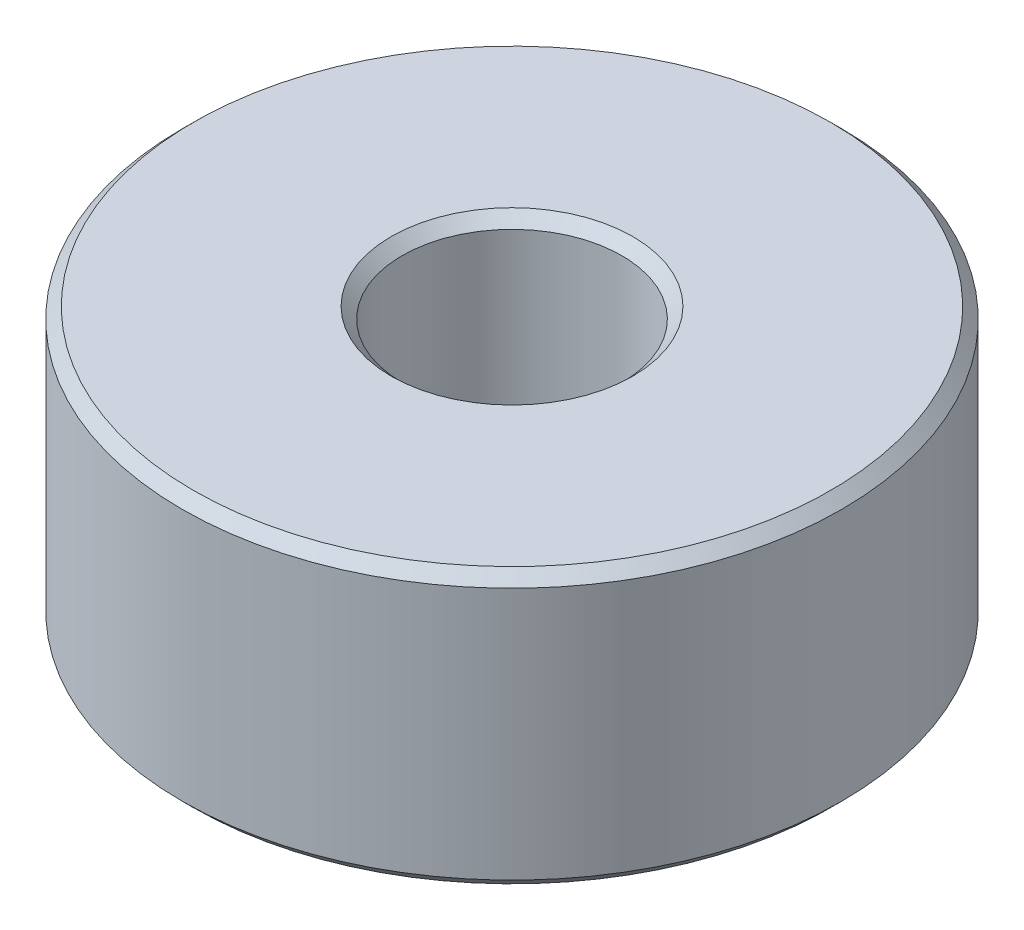
ISO-10303-21;
HEADER;
FILE_DESCRIPTION(('STEP AP214'),'2;1');
FILE_NAME('part.step','',(''),(''),'','','');
FILE_SCHEMA(('AUTOMOTIVE_DESIGN { 1 0 10303 214 1 1 1 1 }'));
ENDSEC;
DATA;
#1=APPLICATION_CONTEXT('core data for automotive mechanical design processes');
#2=APPLICATION_PROTOCOL_DEFINITION('international standard','automotive_design',2000,#1);
#3=PRODUCT_CONTEXT('',#1,'mechanical');
#4=PRODUCT('Part','Part','',(#3));
#5=PRODUCT_RELATED_PRODUCT_CATEGORY('part','',(#4));
#6=PRODUCT_DEFINITION_FORMATION('','',#4);
#7=PRODUCT_DEFINITION_CONTEXT('part definition',#1,'design');
#8=PRODUCT_DEFINITION('design','',#6,#7);
#9=PRODUCT_DEFINITION_SHAPE('','',#8);
#10=(LENGTH_UNIT() NAMED_UNIT(*) SI_UNIT(.MILLI.,.METRE.));
#11=(NAMED_UNIT(*) PLANE_ANGLE_UNIT() SI_UNIT($,.RADIAN.));
#12=(NAMED_UNIT(*) SI_UNIT($,.STERADIAN.) SOLID_ANGLE_UNIT());
#13=UNCERTAINTY_MEASURE_WITH_UNIT(LENGTH_MEASURE(1.E-05),#10,'distance_accuracy_value','');
#14=(GEOMETRIC_REPRESENTATION_CONTEXT(3) GLOBAL_UNCERTAINTY_ASSIGNED_CONTEXT((#13)) GLOBAL_UNIT_ASSIGNED_CONTEXT((#10,
#11,#12)) REPRESENTATION_CONTEXT('',''));
#15=CARTESIAN_POINT('',(0.,0.,0.));
#16=DIRECTION('',(0.,0.,1.));
#17=DIRECTION('',(1.,0.,0.));
#18=AXIS2_PLACEMENT_3D('',#15,#16,#17);
#19=CARTESIAN_POINT('',(0.,2.5,0.));
#20=DIRECTION('',(0.,1.,0.));
#21=DIRECTION('',(0.,0.,1.));
#22=AXIS2_PLACEMENT_3D('',#19,#20,#21);
#23=PLANE('',#22);
#24=CARTESIAN_POINT('',(0.,2.5,0.));
#25=DIRECTION('',(0.,1.,0.));
#26=DIRECTION('',(0.,0.,1.));
#27=AXIS2_PLACEMENT_3D('',#24,#25,#26);
#28=CIRCLE('',#27,1.1);
#29=CARTESIAN_POINT('',(0.,2.5,1.1));
#30=VERTEX_POINT('',#29);
#31=EDGE_CURVE('E10',#30,#30,#28,.F.);
#32=ORIENTED_EDGE('',*,*,#31,.T.);
#33=EDGE_LOOP('',(#32));
#34=FACE_BOUND('',#33,.T.);
#35=CARTESIAN_POINT('',(0.,2.5,0.));
#36=DIRECTION('',(0.,1.,0.));
#37=DIRECTION('',(0.,0.,1.));
#38=AXIS2_PLACEMENT_3D('',#35,#36,#37);
#39=CIRCLE('',#38,2.9);
#40=CARTESIAN_POINT('',(0.,2.5,2.9));
#41=VERTEX_POINT('',#40);
#42=EDGE_CURVE('E40',#41,#41,#39,.T.);
#43=ORIENTED_EDGE('',*,*,#42,.T.);
#44=EDGE_LOOP('',(#43));
#45=FACE_BOUND('',#44,.T.);
#46=ADVANCED_FACE('F32',(#34,#45),#23,.T.);
#47=CARTESIAN_POINT('',(0.,0.,0.));
#48=DIRECTION('',(0.,1.,0.));
#49=DIRECTION('',(0.,0.,1.));
#50=AXIS2_PLACEMENT_3D('',#47,#48,#49);
#51=PLANE('',#50);
#52=CARTESIAN_POINT('',(0.,0.,0.));
#53=DIRECTION('',(0.,1.,0.));
#54=DIRECTION('',(0.,0.,1.));
#55=AXIS2_PLACEMENT_3D('',#52,#53,#54);
#56=CIRCLE('',#55,1.1);
#57=CARTESIAN_POINT('',(0.,0.,1.1));
#58=VERTEX_POINT('',#57);
#59=EDGE_CURVE('E59',#58,#58,#56,.T.);
#60=ORIENTED_EDGE('',*,*,#59,.T.);
#61=EDGE_LOOP('',(#60));
#62=FACE_BOUND('',#61,.T.);
#63=CARTESIAN_POINT('',(0.,0.,0.));
#64=DIRECTION('',(0.,1.,0.));
#65=DIRECTION('',(0.,0.,1.));
#66=AXIS2_PLACEMENT_3D('',#63,#64,#65);
#67=CIRCLE('',#66,2.9);
#68=CARTESIAN_POINT('',(0.,0.,2.9));
#69=VERTEX_POINT('',#68);
#70=EDGE_CURVE('E62',#69,#69,#67,.F.);
#71=ORIENTED_EDGE('',*,*,#70,.T.);
#72=EDGE_LOOP('',(#71));
#73=FACE_BOUND('',#72,.T.);
#74=ADVANCED_FACE('F66',(#62,#73),#51,.F.);
#75=CARTESIAN_POINT('',(0.,2.5,0.));
#76=DIRECTION('',(0.,-1.,0.));
#77=DIRECTION('',(0.,0.,-1.));
#78=AXIS2_PLACEMENT_3D('',#75,#76,#77);
#79=CYLINDRICAL_SURFACE('',#78,3.);
#80=CARTESIAN_POINT('',(0.,0.100000000000001,0.));
#81=DIRECTION('',(0.,1.,0.));
#82=DIRECTION('',(0.,0.,1.));
#83=AXIS2_PLACEMENT_3D('',#80,#81,#82);
#84=CIRCLE('',#83,3.);
#85=CARTESIAN_POINT('',(0.,0.100000000000001,3.));
#86=VERTEX_POINT('',#85);
#87=EDGE_CURVE('E44',#86,#86,#84,.T.);
#88=ORIENTED_EDGE('',*,*,#87,.T.);
#89=EDGE_LOOP('',(#88));
#90=FACE_BOUND('',#89,.T.);
#91=CARTESIAN_POINT('',(0.,2.4,0.));
#92=DIRECTION('',(0.,1.,0.));
#93=DIRECTION('',(0.,0.,1.));
#94=AXIS2_PLACEMENT_3D('',#91,#92,#93);
#95=CIRCLE('',#94,3.);
#96=CARTESIAN_POINT('',(0.,2.4,3.));
#97=VERTEX_POINT('',#96);
#98=EDGE_CURVE('E48',#97,#97,#95,.F.);
#99=ORIENTED_EDGE('',*,*,#98,.T.);
#100=EDGE_LOOP('',(#99));
#101=FACE_BOUND('',#100,.T.);
#102=ADVANCED_FACE('F76',(#90,#101),#79,.T.);
#103=CARTESIAN_POINT('',(0.,2.5,0.));
#104=DIRECTION('',(0.,-1.,0.));
#105=DIRECTION('',(0.,0.,-1.));
#106=AXIS2_PLACEMENT_3D('',#103,#104,#105);
#107=CYLINDRICAL_SURFACE('',#106,1.);
#108=CARTESIAN_POINT('',(0.,0.0999999999999994,0.));
#109=DIRECTION('',(0.,1.,0.));
#110=DIRECTION('',(0.,0.,1.));
#111=AXIS2_PLACEMENT_3D('',#108,#109,#110);
#112=CIRCLE('',#111,1.);
#113=CARTESIAN_POINT('',(0.,0.0999999999999994,1.));
#114=VERTEX_POINT('',#113);
#115=EDGE_CURVE('E53',#114,#114,#112,.F.);
#116=ORIENTED_EDGE('',*,*,#115,.T.);
#117=EDGE_LOOP('',(#116));
#118=FACE_BOUND('',#117,.T.);
#119=CARTESIAN_POINT('',(0.,2.4,0.));
#120=DIRECTION('',(0.,1.,0.));
#121=DIRECTION('',(0.,0.,1.));
#122=AXIS2_PLACEMENT_3D('',#119,#120,#121);
#123=CIRCLE('',#122,1.);
#124=CARTESIAN_POINT('',(0.,2.4,1.));
#125=VERTEX_POINT('',#124);
#126=EDGE_CURVE('E56',#125,#125,#123,.T.);
#127=ORIENTED_EDGE('',*,*,#126,.T.);
#128=EDGE_LOOP('',(#127));
#129=FACE_BOUND('',#128,.T.);
#130=ADVANCED_FACE('F79',(#118,#129),#107,.F.);
#131=CARTESIAN_POINT('',(0.,0.,0.));
#132=DIRECTION('',(0.,-1.,0.));
#133=DIRECTION('',(0.,0.,-1.));
#134=AXIS2_PLACEMENT_3D('',#131,#132,#133);
#135=CONICAL_SURFACE('',#134,1.1,0.785398163397448);
#136=ORIENTED_EDGE('',*,*,#115,.F.);
#137=EDGE_LOOP('',(#136));
#138=FACE_BOUND('',#137,.T.);
#139=ORIENTED_EDGE('',*,*,#59,.F.);
#140=EDGE_LOOP('',(#139));
#141=FACE_BOUND('',#140,.T.);
#142=ADVANCED_FACE('F72',(#138,#141),#135,.F.);
#143=CARTESIAN_POINT('',(0.,0.100000000000001,0.));
#144=DIRECTION('',(0.,1.,0.));
#145=DIRECTION('',(0.,0.,1.));
#146=AXIS2_PLACEMENT_3D('',#143,#144,#145);
#147=CONICAL_SURFACE('',#146,3.,0.785398163397448);
#148=ORIENTED_EDGE('',*,*,#70,.F.);
#149=EDGE_LOOP('',(#148));
#150=FACE_BOUND('',#149,.T.);
#151=ORIENTED_EDGE('',*,*,#87,.F.);
#152=EDGE_LOOP('',(#151));
#153=FACE_BOUND('',#152,.T.);
#154=ADVANCED_FACE('F68',(#150,#153),#147,.T.);
#155=CARTESIAN_POINT('',(0.,2.4,0.));
#156=DIRECTION('',(0.,1.,0.));
#157=DIRECTION('',(0.,0.,1.));
#158=AXIS2_PLACEMENT_3D('',#155,#156,#157);
#159=CONICAL_SURFACE('',#158,1.,0.785398163397448);
#160=ORIENTED_EDGE('',*,*,#31,.F.);
#161=EDGE_LOOP('',(#160));
#162=FACE_BOUND('',#161,.T.);
#163=ORIENTED_EDGE('',*,*,#126,.F.);
#164=EDGE_LOOP('',(#163));
#165=FACE_BOUND('',#164,.T.);
#166=ADVANCED_FACE('F71',(#162,#165),#159,.F.);
#167=CARTESIAN_POINT('',(0.,2.5,0.));
#168=DIRECTION('',(0.,-1.,0.));
#169=DIRECTION('',(0.,0.,-1.));
#170=AXIS2_PLACEMENT_3D('',#167,#168,#169);
#171=CONICAL_SURFACE('',#170,2.9,0.785398163397444);
#172=ORIENTED_EDGE('',*,*,#98,.F.);
#173=EDGE_LOOP('',(#172));
#174=FACE_BOUND('',#173,.T.);
#175=ORIENTED_EDGE('',*,*,#42,.F.);
#176=EDGE_LOOP('',(#175));
#177=FACE_BOUND('',#176,.T.);
#178=ADVANCED_FACE('F35',(#174,#177),#171,.T.);
#179=CLOSED_SHELL('',(#46,#74,#102,#130,#142,#154,#166,#178));
#180=MANIFOLD_SOLID_BREP('B2',#179);
#181=ADVANCED_BREP_SHAPE_REPRESENTATION('',(#18,#180),#14);
#182=SHAPE_DEFINITION_REPRESENTATION(#9,#181);
ENDSEC;
END-ISO-10303-21;
